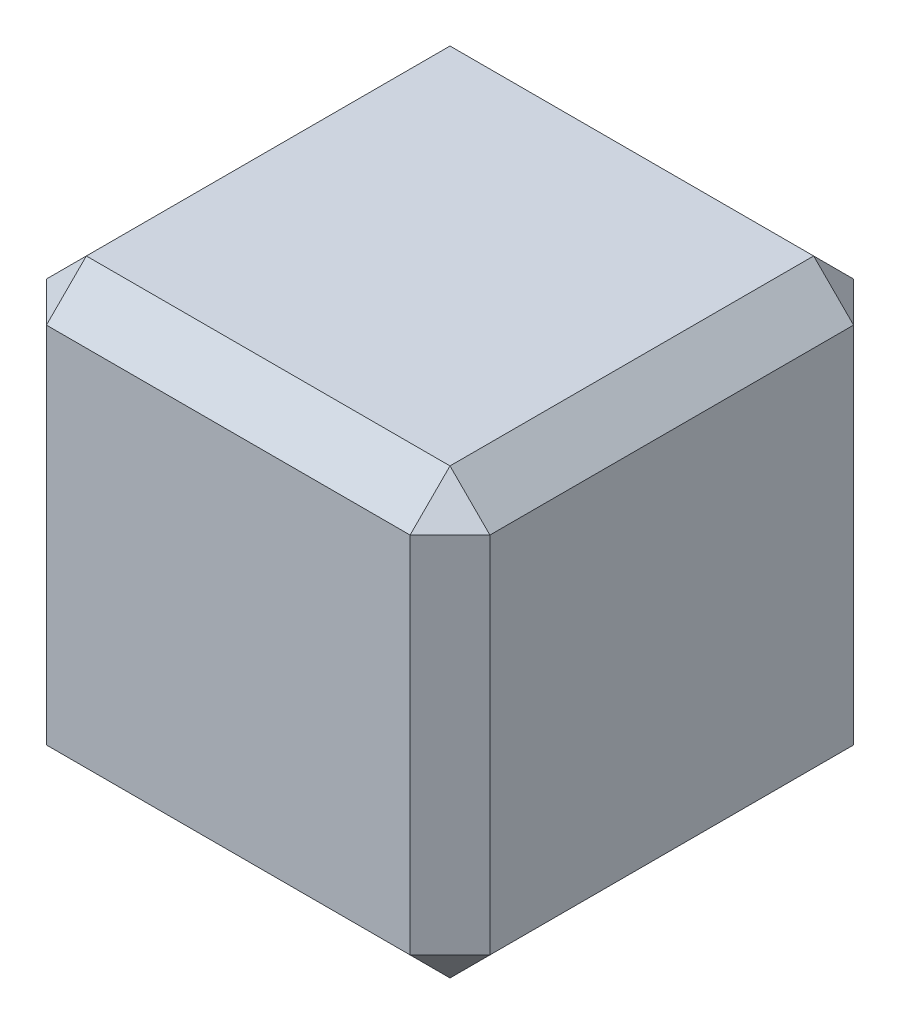
ISO-10303-21;
HEADER;
FILE_DESCRIPTION(('STEP AP214'),'2;1');
FILE_NAME('part.step','',(''),(''),'','','');
FILE_SCHEMA(('AUTOMOTIVE_DESIGN { 1 0 10303 214 1 1 1 1 }'));
ENDSEC;
DATA;
#1=APPLICATION_CONTEXT('core data for automotive mechanical design processes');
#2=APPLICATION_PROTOCOL_DEFINITION('international standard','automotive_design',2000,#1);
#3=PRODUCT_CONTEXT('',#1,'mechanical');
#4=PRODUCT('Part','Part','',(#3));
#5=PRODUCT_RELATED_PRODUCT_CATEGORY('part','',(#4));
#6=PRODUCT_DEFINITION_FORMATION('','',#4);
#7=PRODUCT_DEFINITION_CONTEXT('part definition',#1,'design');
#8=PRODUCT_DEFINITION('design','',#6,#7);
#9=PRODUCT_DEFINITION_SHAPE('','',#8);
#10=(LENGTH_UNIT() NAMED_UNIT(*) SI_UNIT(.MILLI.,.METRE.));
#11=(NAMED_UNIT(*) PLANE_ANGLE_UNIT() SI_UNIT($,.RADIAN.));
#12=(NAMED_UNIT(*) SI_UNIT($,.STERADIAN.) SOLID_ANGLE_UNIT());
#13=UNCERTAINTY_MEASURE_WITH_UNIT(LENGTH_MEASURE(1.E-05),#10,'distance_accuracy_value','');
#14=(GEOMETRIC_REPRESENTATION_CONTEXT(3) GLOBAL_UNCERTAINTY_ASSIGNED_CONTEXT((#13)) GLOBAL_UNIT_ASSIGNED_CONTEXT((#10,
#11,#12)) REPRESENTATION_CONTEXT('',''));
#15=CARTESIAN_POINT('',(0.,0.,0.));
#16=DIRECTION('',(0.,0.,1.));
#17=DIRECTION('',(1.,0.,0.));
#18=AXIS2_PLACEMENT_3D('',#15,#16,#17);
#19=CARTESIAN_POINT('',(100.,-100.,100.));
#20=DIRECTION('',(-1.,0.,0.));
#21=DIRECTION('',(0.,0.,1.));
#22=AXIS2_PLACEMENT_3D('',#19,#20,#21);
#23=PLANE('',#22);
#24=DIRECTION('',(0.,1.,0.));
#25=VECTOR('',#24,1.);
#26=CARTESIAN_POINT('',(100.,100.,-82.));
#27=LINE('',#26,#25);
#28=CARTESIAN_POINT('',(100.,-82.,-82.));
#29=VERTEX_POINT('',#28);
#30=CARTESIAN_POINT('',(100.,82.,-82.));
#31=VERTEX_POINT('',#30);
#32=EDGE_CURVE('E161',#29,#31,#27,.T.);
#33=ORIENTED_EDGE('',*,*,#32,.T.);
#34=DIRECTION('',(0.,0.,1.));
#35=VECTOR('',#34,1.);
#36=CARTESIAN_POINT('',(100.,82.,100.));
#37=LINE('',#36,#35);
#38=CARTESIAN_POINT('',(100.,82.,82.));
#39=VERTEX_POINT('',#38);
#40=EDGE_CURVE('E133',#31,#39,#37,.T.);
#41=ORIENTED_EDGE('',*,*,#40,.T.);
#42=DIRECTION('',(0.,-1.,0.));
#43=VECTOR('',#42,1.);
#44=CARTESIAN_POINT('',(100.,-100.,82.));
#45=LINE('',#44,#43);
#46=CARTESIAN_POINT('',(100.,-82.,82.));
#47=VERTEX_POINT('',#46);
#48=EDGE_CURVE('E169',#39,#47,#45,.T.);
#49=ORIENTED_EDGE('',*,*,#48,.T.);
#50=DIRECTION('',(0.,0.,-1.));
#51=VECTOR('',#50,1.);
#52=CARTESIAN_POINT('',(100.,-82.,100.));
#53=LINE('',#52,#51);
#54=EDGE_CURVE('E163',#47,#29,#53,.T.);
#55=ORIENTED_EDGE('',*,*,#54,.T.);
#56=EDGE_LOOP('',(#33,#41,#49,#55));
#57=FACE_BOUND('',#56,.T.);
#58=ADVANCED_FACE('F37',(#57),#23,.F.);
#59=CARTESIAN_POINT('',(-100.,100.,100.));
#60=DIRECTION('',(0.,-1.,0.));
#61=DIRECTION('',(0.,0.,-1.));
#62=AXIS2_PLACEMENT_3D('',#59,#60,#61);
#63=PLANE('',#62);
#64=DIRECTION('',(1.,0.,0.));
#65=VECTOR('',#64,1.);
#66=CARTESIAN_POINT('',(-100.,100.,81.9999999999999));
#67=LINE('',#66,#65);
#68=CARTESIAN_POINT('',(-81.9999999999999,100.,81.9999999999999));
#69=VERTEX_POINT('',#68);
#70=CARTESIAN_POINT('',(81.9999999999999,100.,81.9999999999999));
#71=VERTEX_POINT('',#70);
#72=EDGE_CURVE('E159',#69,#71,#67,.T.);
#73=ORIENTED_EDGE('',*,*,#72,.T.);
#74=DIRECTION('',(0.,0.,-1.));
#75=VECTOR('',#74,1.);
#76=CARTESIAN_POINT('',(81.9999999999999,100.,100.));
#77=LINE('',#76,#75);
#78=CARTESIAN_POINT('',(81.9999999999999,100.,-82.));
#79=VERTEX_POINT('',#78);
#80=EDGE_CURVE('E131',#71,#79,#77,.T.);
#81=ORIENTED_EDGE('',*,*,#80,.T.);
#82=DIRECTION('',(-1.,0.,0.));
#83=VECTOR('',#82,1.);
#84=CARTESIAN_POINT('',(-100.,100.,-82.));
#85=LINE('',#84,#83);
#86=CARTESIAN_POINT('',(-81.9999999999999,100.,-82.));
#87=VERTEX_POINT('',#86);
#88=EDGE_CURVE('E149',#79,#87,#85,.T.);
#89=ORIENTED_EDGE('',*,*,#88,.T.);
#90=DIRECTION('',(0.,0.,1.));
#91=VECTOR('',#90,1.);
#92=CARTESIAN_POINT('',(-81.9999999999999,100.,100.));
#93=LINE('',#92,#91);
#94=EDGE_CURVE('E155',#87,#69,#93,.T.);
#95=ORIENTED_EDGE('',*,*,#94,.T.);
#96=EDGE_LOOP('',(#73,#81,#89,#95));
#97=FACE_BOUND('',#96,.T.);
#98=ADVANCED_FACE('F157',(#97),#63,.F.);
#99=CARTESIAN_POINT('',(-100.,-100.,100.));
#100=DIRECTION('',(1.,0.,0.));
#101=DIRECTION('',(0.,0.,-1.));
#102=AXIS2_PLACEMENT_3D('',#99,#100,#101);
#103=PLANE('',#102);
#104=DIRECTION('',(0.,0.,1.));
#105=VECTOR('',#104,1.);
#106=CARTESIAN_POINT('',(-100.,-81.9999999999999,100.));
#107=LINE('',#106,#105);
#108=CARTESIAN_POINT('',(-100.,-81.9999999999999,-82.));
#109=VERTEX_POINT('',#108);
#110=CARTESIAN_POINT('',(-100.,-81.9999999999999,81.9999999999999));
#111=VERTEX_POINT('',#110);
#112=EDGE_CURVE('E183',#109,#111,#107,.T.);
#113=ORIENTED_EDGE('',*,*,#112,.T.);
#114=DIRECTION('',(0.,1.,0.));
#115=VECTOR('',#114,1.);
#116=CARTESIAN_POINT('',(-100.,-100.,81.9999999999999));
#117=LINE('',#116,#115);
#118=CARTESIAN_POINT('',(-100.,82.,81.9999999999999));
#119=VERTEX_POINT('',#118);
#120=EDGE_CURVE('E188',#111,#119,#117,.T.);
#121=ORIENTED_EDGE('',*,*,#120,.T.);
#122=DIRECTION('',(0.,0.,-1.));
#123=VECTOR('',#122,1.);
#124=CARTESIAN_POINT('',(-100.,82.,100.));
#125=LINE('',#124,#123);
#126=CARTESIAN_POINT('',(-100.,82.,-82.));
#127=VERTEX_POINT('',#126);
#128=EDGE_CURVE('E185',#119,#127,#125,.T.);
#129=ORIENTED_EDGE('',*,*,#128,.T.);
#130=DIRECTION('',(0.,-1.,0.));
#131=VECTOR('',#130,1.);
#132=CARTESIAN_POINT('',(-100.,-100.,-82.));
#133=LINE('',#132,#131);
#134=EDGE_CURVE('E181',#127,#109,#133,.T.);
#135=ORIENTED_EDGE('',*,*,#134,.T.);
#136=EDGE_LOOP('',(#113,#121,#129,#135));
#137=FACE_BOUND('',#136,.T.);
#138=ADVANCED_FACE('F285',(#137),#103,.F.);
#139=CARTESIAN_POINT('',(-100.,-100.,100.));
#140=DIRECTION('',(0.,1.,0.));
#141=DIRECTION('',(0.,0.,1.));
#142=AXIS2_PLACEMENT_3D('',#139,#140,#141);
#143=PLANE('',#142);
#144=DIRECTION('',(-1.,0.,0.));
#145=VECTOR('',#144,1.);
#146=CARTESIAN_POINT('',(-100.,-100.,81.9999999999999));
#147=LINE('',#146,#145);
#148=CARTESIAN_POINT('',(81.9999999999999,-100.,81.9999999999999));
#149=VERTEX_POINT('',#148);
#150=CARTESIAN_POINT('',(-82.,-100.,81.9999999999999));
#151=VERTEX_POINT('',#150);
#152=EDGE_CURVE('E194',#149,#151,#147,.T.);
#153=ORIENTED_EDGE('',*,*,#152,.T.);
#154=DIRECTION('',(0.,0.,-1.));
#155=VECTOR('',#154,1.);
#156=CARTESIAN_POINT('',(-82.,-100.,100.));
#157=LINE('',#156,#155);
#158=CARTESIAN_POINT('',(-82.,-100.,-82.));
#159=VERTEX_POINT('',#158);
#160=EDGE_CURVE('E196',#151,#159,#157,.T.);
#161=ORIENTED_EDGE('',*,*,#160,.T.);
#162=DIRECTION('',(1.,0.,0.));
#163=VECTOR('',#162,1.);
#164=CARTESIAN_POINT('',(100.,-100.,-82.));
#165=LINE('',#164,#163);
#166=CARTESIAN_POINT('',(81.9999999999999,-100.,-82.));
#167=VERTEX_POINT('',#166);
#168=EDGE_CURVE('E190',#159,#167,#165,.T.);
#169=ORIENTED_EDGE('',*,*,#168,.T.);
#170=DIRECTION('',(0.,0.,1.));
#171=VECTOR('',#170,1.);
#172=CARTESIAN_POINT('',(81.9999999999999,-100.,100.));
#173=LINE('',#172,#171);
#174=EDGE_CURVE('E192',#167,#149,#173,.T.);
#175=ORIENTED_EDGE('',*,*,#174,.T.);
#176=EDGE_LOOP('',(#153,#161,#169,#175));
#177=FACE_BOUND('',#176,.T.);
#178=ADVANCED_FACE('F295',(#177),#143,.F.);
#179=CARTESIAN_POINT('',(0.,0.,100.));
#180=DIRECTION('',(0.,0.,-1.));
#181=DIRECTION('',(-1.,0.,0.));
#182=AXIS2_PLACEMENT_3D('',#179,#180,#181);
#183=PLANE('',#182);
#184=DIRECTION('',(0.,1.,0.));
#185=VECTOR('',#184,1.);
#186=CARTESIAN_POINT('',(81.9999999999999,0.,100.));
#187=LINE('',#186,#185);
#188=CARTESIAN_POINT('',(81.9999999999999,-82.,100.));
#189=VERTEX_POINT('',#188);
#190=CARTESIAN_POINT('',(81.9999999999999,82.,100.));
#191=VERTEX_POINT('',#190);
#192=EDGE_CURVE('E176',#189,#191,#187,.T.);
#193=ORIENTED_EDGE('',*,*,#192,.T.);
#194=DIRECTION('',(-1.,0.,0.));
#195=VECTOR('',#194,1.);
#196=CARTESIAN_POINT('',(0.,82.,100.));
#197=LINE('',#196,#195);
#198=CARTESIAN_POINT('',(-82.,82.,100.));
#199=VERTEX_POINT('',#198);
#200=EDGE_CURVE('E178',#191,#199,#197,.T.);
#201=ORIENTED_EDGE('',*,*,#200,.T.);
#202=DIRECTION('',(0.,-1.,0.));
#203=VECTOR('',#202,1.);
#204=CARTESIAN_POINT('',(-82.,0.,100.));
#205=LINE('',#204,#203);
#206=CARTESIAN_POINT('',(-82.,-82.,100.));
#207=VERTEX_POINT('',#206);
#208=EDGE_CURVE('E174',#199,#207,#205,.T.);
#209=ORIENTED_EDGE('',*,*,#208,.T.);
#210=DIRECTION('',(1.,0.,0.));
#211=VECTOR('',#210,1.);
#212=CARTESIAN_POINT('',(0.,-82.,100.));
#213=LINE('',#212,#211);
#214=EDGE_CURVE('E172',#207,#189,#213,.T.);
#215=ORIENTED_EDGE('',*,*,#214,.T.);
#216=EDGE_LOOP('',(#193,#201,#209,#215));
#217=FACE_BOUND('',#216,.T.);
#218=ADVANCED_FACE('F276',(#217),#183,.F.);
#219=CARTESIAN_POINT('',(0.,0.,-100.));
#220=DIRECTION('',(0.,0.,-1.));
#221=DIRECTION('',(-1.,0.,0.));
#222=AXIS2_PLACEMENT_3D('',#219,#220,#221);
#223=PLANE('',#222);
#224=DIRECTION('',(0.,-1.,0.));
#225=VECTOR('',#224,1.);
#226=CARTESIAN_POINT('',(81.9999999999999,-100.,-100.));
#227=LINE('',#226,#225);
#228=CARTESIAN_POINT('',(81.9999999999999,81.9999999999999,-100.));
#229=VERTEX_POINT('',#228);
#230=CARTESIAN_POINT('',(81.9999999999999,-81.9999999999999,-100.));
#231=VERTEX_POINT('',#230);
#232=EDGE_CURVE('E199',#229,#231,#227,.T.);
#233=ORIENTED_EDGE('',*,*,#232,.T.);
#234=DIRECTION('',(-1.,0.,0.));
#235=VECTOR('',#234,1.);
#236=CARTESIAN_POINT('',(-100.,-81.9999999999999,-100.));
#237=LINE('',#236,#235);
#238=CARTESIAN_POINT('',(-81.9999999999999,-81.9999999999999,-100.));
#239=VERTEX_POINT('',#238);
#240=EDGE_CURVE('E11',#231,#239,#237,.T.);
#241=ORIENTED_EDGE('',*,*,#240,.T.);
#242=DIRECTION('',(0.,1.,0.));
#243=VECTOR('',#242,1.);
#244=CARTESIAN_POINT('',(-81.9999999999999,100.,-100.));
#245=LINE('',#244,#243);
#246=CARTESIAN_POINT('',(-81.9999999999999,81.9999999999999,-100.));
#247=VERTEX_POINT('',#246);
#248=EDGE_CURVE('E47',#239,#247,#245,.T.);
#249=ORIENTED_EDGE('',*,*,#248,.T.);
#250=DIRECTION('',(1.,0.,0.));
#251=VECTOR('',#250,1.);
#252=CARTESIAN_POINT('',(100.,81.9999999999999,-100.));
#253=LINE('',#252,#251);
#254=EDGE_CURVE('E201',#247,#229,#253,.T.);
#255=ORIENTED_EDGE('',*,*,#254,.T.);
#256=EDGE_LOOP('',(#233,#241,#249,#255));
#257=FACE_BOUND('',#256,.T.);
#258=ADVANCED_FACE('F430',(#257),#223,.T.);
#259=CARTESIAN_POINT('',(-82.,-100.,100.));
#260=DIRECTION('',(0.70710678118655,0.707106781186545,0.));
#261=DIRECTION('',(0.,0.,-1.));
#262=AXIS2_PLACEMENT_3D('',#259,#260,#261);
#263=PLANE('',#262);
#264=DIRECTION('',(-0.707106781186545,0.70710678118655,0.));
#265=VECTOR('',#264,1.);
#266=CARTESIAN_POINT('',(-100.,-81.9999999999999,81.9999999999999));
#267=LINE('',#266,#265);
#268=EDGE_CURVE('E42',#111,#151,#267,.F.);
#269=ORIENTED_EDGE('',*,*,#268,.F.);
#270=ORIENTED_EDGE('',*,*,#112,.F.);
#271=DIRECTION('',(0.707106781186545,-0.70710678118655,0.));
#272=VECTOR('',#271,1.);
#273=CARTESIAN_POINT('',(-82.,-100.,-82.));
#274=LINE('',#273,#272);
#275=EDGE_CURVE('E253',#159,#109,#274,.F.);
#276=ORIENTED_EDGE('',*,*,#275,.F.);
#277=ORIENTED_EDGE('',*,*,#160,.F.);
#278=EDGE_LOOP('',(#269,#270,#276,#277));
#279=FACE_BOUND('',#278,.T.);
#280=ADVANCED_FACE('F40',(#279),#263,.F.);
#281=CARTESIAN_POINT('',(-100.,-81.9999999999999,81.9999999999999));
#282=DIRECTION('',(-0.577350269189629,-0.577350269189626,0.577350269189622));
#283=DIRECTION('',(0.707106781186545,-0.70710678118655,0.));
#284=AXIS2_PLACEMENT_3D('',#281,#282,#283);
#285=PLANE('',#284);
#286=DIRECTION('',(0.707106781186545,0.,0.70710678118655));
#287=VECTOR('',#286,1.);
#288=CARTESIAN_POINT('',(-100.,-81.9999999999999,81.9999999999999));
#289=LINE('',#288,#287);
#290=EDGE_CURVE('E248',#111,#207,#289,.T.);
#291=ORIENTED_EDGE('',*,*,#290,.F.);
#292=ORIENTED_EDGE('',*,*,#268,.T.);
#293=DIRECTION('',(0.,-0.707106781186545,-0.70710678118655));
#294=VECTOR('',#293,1.);
#295=CARTESIAN_POINT('',(-82.,-91.,91.));
#296=LINE('',#295,#294);
#297=EDGE_CURVE('E251',#207,#151,#296,.T.);
#298=ORIENTED_EDGE('',*,*,#297,.F.);
#299=EDGE_LOOP('',(#291,#292,#298));
#300=FACE_BOUND('',#299,.T.);
#301=ADVANCED_FACE('F263',(#300),#285,.T.);
#302=CARTESIAN_POINT('',(-82.,-100.,-82.));
#303=DIRECTION('',(-0.577350269189626,-0.577350269189622,-0.577350269189629));
#304=DIRECTION('',(-0.70710678118655,0.,0.707106781186545));
#305=AXIS2_PLACEMENT_3D('',#302,#303,#304);
#306=PLANE('',#305);
#307=DIRECTION('',(0.,-0.70710678118655,0.707106781186545));
#308=VECTOR('',#307,1.);
#309=CARTESIAN_POINT('',(-82.,-100.,-82.));
#310=LINE('',#309,#308);
#311=EDGE_CURVE('E243',#159,#239,#310,.F.);
#312=ORIENTED_EDGE('',*,*,#311,.F.);
#313=ORIENTED_EDGE('',*,*,#275,.T.);
#314=DIRECTION('',(0.70710678118655,0.,-0.707106781186545));
#315=VECTOR('',#314,1.);
#316=CARTESIAN_POINT('',(-91.,-81.9999999999999,-91.));
#317=LINE('',#316,#315);
#318=EDGE_CURVE('E246',#239,#109,#317,.F.);
#319=ORIENTED_EDGE('',*,*,#318,.F.);
#320=EDGE_LOOP('',(#312,#313,#319));
#321=FACE_BOUND('',#320,.T.);
#322=ADVANCED_FACE('F420',(#321),#306,.T.);
#323=CARTESIAN_POINT('',(0.,-82.,100.));
#324=DIRECTION('',(0.,0.70710678118655,-0.707106781186545));
#325=DIRECTION('',(1.,0.,0.));
#326=AXIS2_PLACEMENT_3D('',#323,#324,#325);
#327=PLANE('',#326);
#328=ORIENTED_EDGE('',*,*,#297,.T.);
#329=ORIENTED_EDGE('',*,*,#152,.F.);
#330=DIRECTION('',(0.,0.707106781186545,0.70710678118655));
#331=VECTOR('',#330,1.);
#332=CARTESIAN_POINT('',(81.9999999999999,-91.,91.));
#333=LINE('',#332,#331);
#334=EDGE_CURVE('E237',#189,#149,#333,.F.);
#335=ORIENTED_EDGE('',*,*,#334,.F.);
#336=ORIENTED_EDGE('',*,*,#214,.F.);
#337=EDGE_LOOP('',(#328,#329,#335,#336));
#338=FACE_BOUND('',#337,.T.);
#339=ADVANCED_FACE('F271',(#338),#327,.F.);
#340=CARTESIAN_POINT('',(-82.,0.,100.));
#341=DIRECTION('',(0.70710678118655,0.,-0.707106781186545));
#342=DIRECTION('',(0.,-1.,0.));
#343=AXIS2_PLACEMENT_3D('',#340,#341,#342);
#344=PLANE('',#343);
#345=ORIENTED_EDGE('',*,*,#290,.T.);
#346=ORIENTED_EDGE('',*,*,#208,.F.);
#347=DIRECTION('',(-0.707106781186545,0.,-0.70710678118655));
#348=VECTOR('',#347,1.);
#349=CARTESIAN_POINT('',(-82.,82.,100.));
#350=LINE('',#349,#348);
#351=EDGE_CURVE('E234',#119,#199,#350,.F.);
#352=ORIENTED_EDGE('',*,*,#351,.F.);
#353=ORIENTED_EDGE('',*,*,#120,.F.);
#354=EDGE_LOOP('',(#345,#346,#352,#353));
#355=FACE_BOUND('',#354,.T.);
#356=ADVANCED_FACE('F282',(#355),#344,.F.);
#357=CARTESIAN_POINT('',(-100.,82.,100.));
#358=DIRECTION('',(0.707106781186545,-0.70710678118655,0.));
#359=DIRECTION('',(0.,0.,-1.));
#360=AXIS2_PLACEMENT_3D('',#357,#358,#359);
#361=PLANE('',#360);
#362=DIRECTION('',(-0.70710678118655,-0.707106781186545,0.));
#363=VECTOR('',#362,1.);
#364=CARTESIAN_POINT('',(-100.,82.,-82.));
#365=LINE('',#364,#363);
#366=EDGE_CURVE('E228',#127,#87,#365,.F.);
#367=ORIENTED_EDGE('',*,*,#366,.F.);
#368=ORIENTED_EDGE('',*,*,#128,.F.);
#369=DIRECTION('',(0.70710678118655,0.707106781186545,0.));
#370=VECTOR('',#369,1.);
#371=CARTESIAN_POINT('',(-91.,91.,81.9999999999999));
#372=LINE('',#371,#370);
#373=EDGE_CURVE('E231',#69,#119,#372,.F.);
#374=ORIENTED_EDGE('',*,*,#373,.F.);
#375=ORIENTED_EDGE('',*,*,#94,.F.);
#376=EDGE_LOOP('',(#367,#368,#374,#375));
#377=FACE_BOUND('',#376,.T.);
#378=ADVANCED_FACE('F289',(#377),#361,.F.);
#379=CARTESIAN_POINT('',(-100.,-100.,-82.));
#380=DIRECTION('',(-0.707106781186545,0.,-0.70710678118655));
#381=DIRECTION('',(0.,1.,0.));
#382=AXIS2_PLACEMENT_3D('',#379,#380,#381);
#383=PLANE('',#382);
#384=ORIENTED_EDGE('',*,*,#318,.T.);
#385=ORIENTED_EDGE('',*,*,#134,.F.);
#386=DIRECTION('',(-0.70710678118655,0.,0.707106781186545));
#387=VECTOR('',#386,1.);
#388=CARTESIAN_POINT('',(-100.,82.,-82.));
#389=LINE('',#388,#387);
#390=EDGE_CURVE('E226',#247,#127,#389,.T.);
#391=ORIENTED_EDGE('',*,*,#390,.F.);
#392=ORIENTED_EDGE('',*,*,#248,.F.);
#393=EDGE_LOOP('',(#384,#385,#391,#392));
#394=FACE_BOUND('',#393,.T.);
#395=ADVANCED_FACE('F293',(#394),#383,.T.);
#396=CARTESIAN_POINT('',(-100.,-100.,-82.));
#397=DIRECTION('',(0.,-0.707106781186545,-0.70710678118655));
#398=DIRECTION('',(-1.,0.,0.));
#399=AXIS2_PLACEMENT_3D('',#396,#397,#398);
#400=PLANE('',#399);
#401=ORIENTED_EDGE('',*,*,#311,.T.);
#402=ORIENTED_EDGE('',*,*,#240,.F.);
#403=DIRECTION('',(0.,0.70710678118655,-0.707106781186545));
#404=VECTOR('',#403,1.);
#405=CARTESIAN_POINT('',(81.9999999999999,-91.,-91.));
#406=LINE('',#405,#404);
#407=EDGE_CURVE('E223',#167,#231,#406,.T.);
#408=ORIENTED_EDGE('',*,*,#407,.F.);
#409=ORIENTED_EDGE('',*,*,#168,.F.);
#410=EDGE_LOOP('',(#401,#402,#408,#409));
#411=FACE_BOUND('',#410,.T.);
#412=ADVANCED_FACE('F305',(#411),#400,.T.);
#413=CARTESIAN_POINT('',(100.,-82.,100.));
#414=DIRECTION('',(-0.707106781186545,0.70710678118655,0.));
#415=DIRECTION('',(0.,0.,-1.));
#416=AXIS2_PLACEMENT_3D('',#413,#414,#415);
#417=PLANE('',#416);
#418=DIRECTION('',(-0.70710678118655,-0.707106781186545,0.));
#419=VECTOR('',#418,1.);
#420=CARTESIAN_POINT('',(100.,-82.,82.));
#421=LINE('',#420,#419);
#422=EDGE_CURVE('E240',#149,#47,#421,.F.);
#423=ORIENTED_EDGE('',*,*,#422,.F.);
#424=ORIENTED_EDGE('',*,*,#174,.F.);
#425=DIRECTION('',(0.70710678118655,0.707106781186545,0.));
#426=VECTOR('',#425,1.);
#427=CARTESIAN_POINT('',(100.,-82.,-82.));
#428=LINE('',#427,#426);
#429=EDGE_CURVE('E220',#29,#167,#428,.F.);
#430=ORIENTED_EDGE('',*,*,#429,.F.);
#431=ORIENTED_EDGE('',*,*,#54,.F.);
#432=EDGE_LOOP('',(#423,#424,#430,#431));
#433=FACE_BOUND('',#432,.T.);
#434=ADVANCED_FACE('F300',(#433),#417,.F.);
#435=CARTESIAN_POINT('',(100.,-82.,82.));
#436=DIRECTION('',(0.577350269189622,-0.577350269189629,0.577350269189626));
#437=DIRECTION('',(0.,-0.707106781186545,-0.70710678118655));
#438=AXIS2_PLACEMENT_3D('',#435,#436,#437);
#439=PLANE('',#438);
#440=ORIENTED_EDGE('',*,*,#334,.T.);
#441=ORIENTED_EDGE('',*,*,#422,.T.);
#442=DIRECTION('',(0.70710678118655,0.,-0.707106781186545));
#443=VECTOR('',#442,1.);
#444=CARTESIAN_POINT('',(100.,-82.,82.));
#445=LINE('',#444,#443);
#446=EDGE_CURVE('E217',#189,#47,#445,.T.);
#447=ORIENTED_EDGE('',*,*,#446,.F.);
#448=EDGE_LOOP('',(#440,#441,#447));
#449=FACE_BOUND('',#448,.T.);
#450=ADVANCED_FACE('F315',(#449),#439,.T.);
#451=CARTESIAN_POINT('',(-82.,82.,100.));
#452=DIRECTION('',(-0.577350269189626,0.577350269189629,0.577350269189622));
#453=DIRECTION('',(-0.70710678118655,-0.707106781186545,0.));
#454=AXIS2_PLACEMENT_3D('',#451,#452,#453);
#455=PLANE('',#454);
#456=ORIENTED_EDGE('',*,*,#373,.T.);
#457=ORIENTED_EDGE('',*,*,#351,.T.);
#458=DIRECTION('',(0.,-0.707106781186545,0.70710678118655));
#459=VECTOR('',#458,1.);
#460=CARTESIAN_POINT('',(-82.,82.,100.));
#461=LINE('',#460,#459);
#462=EDGE_CURVE('E215',#69,#199,#461,.T.);
#463=ORIENTED_EDGE('',*,*,#462,.F.);
#464=EDGE_LOOP('',(#456,#457,#463));
#465=FACE_BOUND('',#464,.T.);
#466=ADVANCED_FACE('F325',(#465),#455,.T.);
#467=CARTESIAN_POINT('',(-100.,82.,-82.));
#468=DIRECTION('',(-0.577350269189622,0.577350269189626,-0.577350269189629));
#469=DIRECTION('',(0.,0.70710678118655,0.707106781186545));
#470=AXIS2_PLACEMENT_3D('',#467,#468,#469);
#471=PLANE('',#470);
#472=ORIENTED_EDGE('',*,*,#390,.T.);
#473=ORIENTED_EDGE('',*,*,#366,.T.);
#474=DIRECTION('',(0.,-0.70710678118655,-0.707106781186545));
#475=VECTOR('',#474,1.);
#476=CARTESIAN_POINT('',(-81.9999999999999,91.,-91.));
#477=LINE('',#476,#475);
#478=EDGE_CURVE('E152',#247,#87,#477,.F.);
#479=ORIENTED_EDGE('',*,*,#478,.F.);
#480=EDGE_LOOP('',(#472,#473,#479));
#481=FACE_BOUND('',#480,.T.);
#482=ADVANCED_FACE('F327',(#481),#471,.T.);
#483=CARTESIAN_POINT('',(100.,-82.,-82.));
#484=DIRECTION('',(0.577350269189622,-0.577350269189626,-0.577350269189629));
#485=DIRECTION('',(0.,0.70710678118655,-0.707106781186545));
#486=AXIS2_PLACEMENT_3D('',#483,#484,#485);
#487=PLANE('',#486);
#488=ORIENTED_EDGE('',*,*,#429,.T.);
#489=ORIENTED_EDGE('',*,*,#407,.T.);
#490=DIRECTION('',(0.70710678118655,0.,0.707106781186545));
#491=VECTOR('',#490,1.);
#492=CARTESIAN_POINT('',(100.,-82.,-82.));
#493=LINE('',#492,#491);
#494=EDGE_CURVE('E211',#29,#231,#493,.F.);
#495=ORIENTED_EDGE('',*,*,#494,.F.);
#496=EDGE_LOOP('',(#488,#489,#495));
#497=FACE_BOUND('',#496,.T.);
#498=ADVANCED_FACE('F307',(#497),#487,.T.);
#499=CARTESIAN_POINT('',(81.9999999999999,0.,100.));
#500=DIRECTION('',(-0.707106781186545,0.,-0.70710678118655));
#501=DIRECTION('',(0.,1.,0.));
#502=AXIS2_PLACEMENT_3D('',#499,#500,#501);
#503=PLANE('',#502);
#504=ORIENTED_EDGE('',*,*,#446,.T.);
#505=ORIENTED_EDGE('',*,*,#48,.F.);
#506=DIRECTION('',(-0.70710678118655,0.,0.707106781186545));
#507=VECTOR('',#506,1.);
#508=CARTESIAN_POINT('',(100.,82.,82.));
#509=LINE('',#508,#507);
#510=EDGE_CURVE('E208',#191,#39,#509,.F.);
#511=ORIENTED_EDGE('',*,*,#510,.F.);
#512=ORIENTED_EDGE('',*,*,#192,.F.);
#513=EDGE_LOOP('',(#504,#505,#511,#512));
#514=FACE_BOUND('',#513,.T.);
#515=ADVANCED_FACE('F317',(#514),#503,.F.);
#516=CARTESIAN_POINT('',(0.,82.,100.));
#517=DIRECTION('',(0.,-0.70710678118655,-0.707106781186545));
#518=DIRECTION('',(-1.,0.,0.));
#519=AXIS2_PLACEMENT_3D('',#516,#517,#518);
#520=PLANE('',#519);
#521=ORIENTED_EDGE('',*,*,#462,.T.);
#522=ORIENTED_EDGE('',*,*,#200,.F.);
#523=DIRECTION('',(0.,0.707106781186545,-0.70710678118655));
#524=VECTOR('',#523,1.);
#525=CARTESIAN_POINT('',(81.9999999999999,91.,91.));
#526=LINE('',#525,#524);
#527=EDGE_CURVE('E146',#71,#191,#526,.F.);
#528=ORIENTED_EDGE('',*,*,#527,.F.);
#529=ORIENTED_EDGE('',*,*,#72,.F.);
#530=EDGE_LOOP('',(#521,#522,#528,#529));
#531=FACE_BOUND('',#530,.T.);
#532=ADVANCED_FACE('F323',(#531),#520,.F.);
#533=CARTESIAN_POINT('',(-100.,100.,-82.));
#534=DIRECTION('',(0.,0.707106781186545,-0.70710678118655));
#535=DIRECTION('',(1.,0.,0.));
#536=AXIS2_PLACEMENT_3D('',#533,#534,#535);
#537=PLANE('',#536);
#538=ORIENTED_EDGE('',*,*,#478,.T.);
#539=ORIENTED_EDGE('',*,*,#88,.F.);
#540=DIRECTION('',(0.,0.70710678118655,0.707106781186545));
#541=VECTOR('',#540,1.);
#542=CARTESIAN_POINT('',(81.9999999999999,100.,-82.));
#543=LINE('',#542,#541);
#544=EDGE_CURVE('E139',#229,#79,#543,.T.);
#545=ORIENTED_EDGE('',*,*,#544,.F.);
#546=ORIENTED_EDGE('',*,*,#254,.F.);
#547=EDGE_LOOP('',(#538,#539,#545,#546));
#548=FACE_BOUND('',#547,.T.);
#549=ADVANCED_FACE('F150',(#548),#537,.T.);
#550=CARTESIAN_POINT('',(100.,-100.,-82.));
#551=DIRECTION('',(0.707106781186545,0.,-0.70710678118655));
#552=DIRECTION('',(0.,-1.,0.));
#553=AXIS2_PLACEMENT_3D('',#550,#551,#552);
#554=PLANE('',#553);
#555=ORIENTED_EDGE('',*,*,#494,.T.);
#556=ORIENTED_EDGE('',*,*,#232,.F.);
#557=DIRECTION('',(-0.70710678118655,0.,-0.707106781186545));
#558=VECTOR('',#557,1.);
#559=CARTESIAN_POINT('',(91.,82.,-91.));
#560=LINE('',#559,#558);
#561=EDGE_CURVE('E143',#31,#229,#560,.T.);
#562=ORIENTED_EDGE('',*,*,#561,.F.);
#563=ORIENTED_EDGE('',*,*,#32,.F.);
#564=EDGE_LOOP('',(#555,#556,#562,#563));
#565=FACE_BOUND('',#564,.T.);
#566=ADVANCED_FACE('F311',(#565),#554,.T.);
#567=CARTESIAN_POINT('',(100.,82.,82.));
#568=DIRECTION('',(0.577350269189622,0.577350269189629,0.577350269189626));
#569=DIRECTION('',(0.,-0.707106781186545,0.70710678118655));
#570=AXIS2_PLACEMENT_3D('',#567,#568,#569);
#571=PLANE('',#570);
#572=ORIENTED_EDGE('',*,*,#527,.T.);
#573=ORIENTED_EDGE('',*,*,#510,.T.);
#574=DIRECTION('',(0.70710678118655,-0.707106781186545,0.));
#575=VECTOR('',#574,1.);
#576=CARTESIAN_POINT('',(100.,82.,82.));
#577=LINE('',#576,#575);
#578=EDGE_CURVE('E136',#71,#39,#577,.T.);
#579=ORIENTED_EDGE('',*,*,#578,.F.);
#580=EDGE_LOOP('',(#572,#573,#579));
#581=FACE_BOUND('',#580,.T.);
#582=ADVANCED_FACE('F321',(#581),#571,.T.);
#583=CARTESIAN_POINT('',(81.9999999999999,100.,-82.));
#584=DIRECTION('',(0.577350269189622,0.577350269189626,-0.577350269189629));
#585=DIRECTION('',(0.,0.70710678118655,0.707106781186545));
#586=AXIS2_PLACEMENT_3D('',#583,#584,#585);
#587=PLANE('',#586);
#588=ORIENTED_EDGE('',*,*,#561,.T.);
#589=ORIENTED_EDGE('',*,*,#544,.T.);
#590=DIRECTION('',(-0.70710678118655,0.707106781186545,0.));
#591=VECTOR('',#590,1.);
#592=CARTESIAN_POINT('',(81.9999999999999,100.,-82.));
#593=LINE('',#592,#591);
#594=EDGE_CURVE('E127',#31,#79,#593,.T.);
#595=ORIENTED_EDGE('',*,*,#594,.F.);
#596=EDGE_LOOP('',(#588,#589,#595));
#597=FACE_BOUND('',#596,.T.);
#598=ADVANCED_FACE('F141',(#597),#587,.T.);
#599=CARTESIAN_POINT('',(81.9999999999999,100.,100.));
#600=DIRECTION('',(-0.707106781186545,-0.70710678118655,0.));
#601=DIRECTION('',(0.,0.,-1.));
#602=AXIS2_PLACEMENT_3D('',#599,#600,#601);
#603=PLANE('',#602);
#604=ORIENTED_EDGE('',*,*,#578,.T.);
#605=ORIENTED_EDGE('',*,*,#40,.F.);
#606=ORIENTED_EDGE('',*,*,#594,.T.);
#607=ORIENTED_EDGE('',*,*,#80,.F.);
#608=EDGE_LOOP('',(#604,#605,#606,#607));
#609=FACE_BOUND('',#608,.T.);
#610=ADVANCED_FACE('F129',(#609),#603,.F.);
#611=CLOSED_SHELL('',(#58,#98,#138,#178,#218,#258,#280,#301,#322,#339,#356,#378,#395,#412,#434,
#450,#466,#482,#498,#515,#532,#549,#566,#582,#598,#610));
#612=MANIFOLD_SOLID_BREP('B2',#611);
#613=ADVANCED_BREP_SHAPE_REPRESENTATION('',(#18,#612),#14);
#614=SHAPE_DEFINITION_REPRESENTATION(#9,#613);
ENDSEC;
END-ISO-10303-21;
